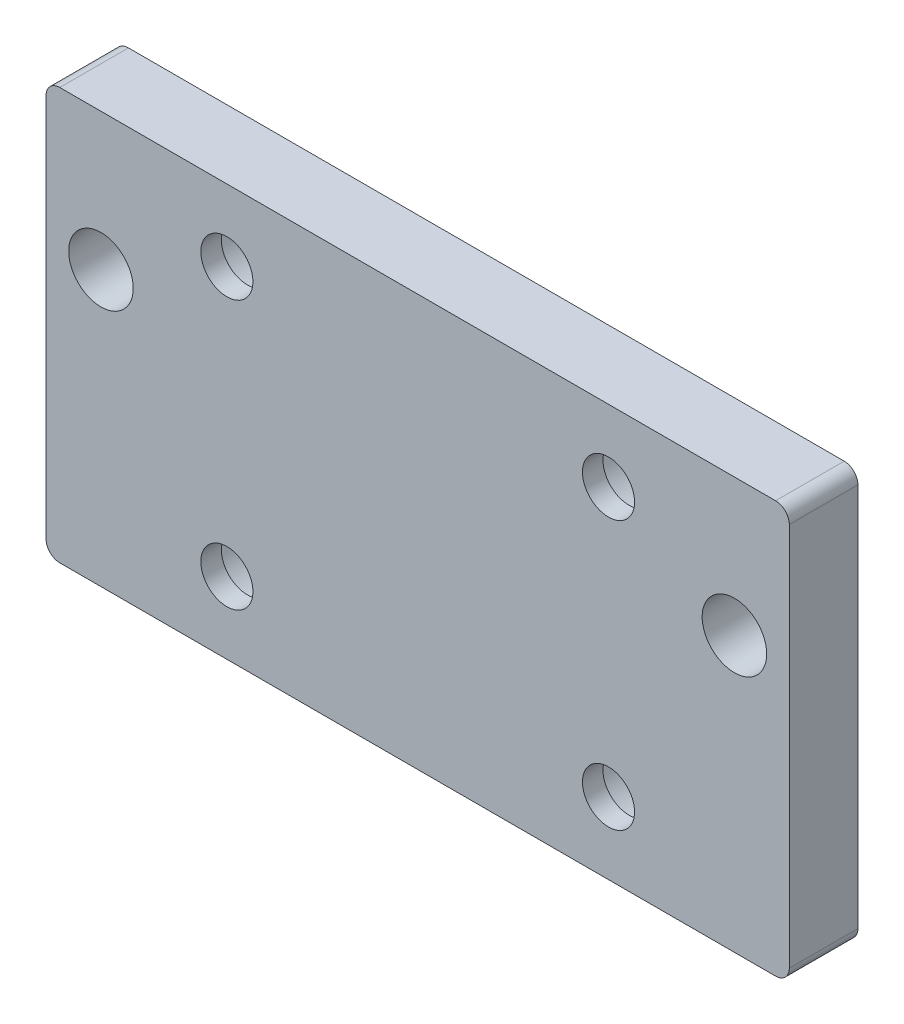
ISO-10303-21;
HEADER;
FILE_DESCRIPTION(('STEP AP214'),'2;1');
FILE_NAME('part.step','',(''),(''),'','','');
FILE_SCHEMA(('AUTOMOTIVE_DESIGN { 1 0 10303 214 1 1 1 1 }'));
ENDSEC;
DATA;
#1=APPLICATION_CONTEXT('core data for automotive mechanical design processes');
#2=APPLICATION_PROTOCOL_DEFINITION('international standard','automotive_design',2000,#1);
#3=PRODUCT_CONTEXT('',#1,'mechanical');
#4=PRODUCT('Part','Part','',(#3));
#5=PRODUCT_RELATED_PRODUCT_CATEGORY('part','',(#4));
#6=PRODUCT_DEFINITION_FORMATION('','',#4);
#7=PRODUCT_DEFINITION_CONTEXT('part definition',#1,'design');
#8=PRODUCT_DEFINITION('design','',#6,#7);
#9=PRODUCT_DEFINITION_SHAPE('','',#8);
#10=(LENGTH_UNIT() NAMED_UNIT(*) SI_UNIT(.MILLI.,.METRE.));
#11=(NAMED_UNIT(*) PLANE_ANGLE_UNIT() SI_UNIT($,.RADIAN.));
#12=(NAMED_UNIT(*) SI_UNIT($,.STERADIAN.) SOLID_ANGLE_UNIT());
#13=UNCERTAINTY_MEASURE_WITH_UNIT(LENGTH_MEASURE(1.E-05),#10,'distance_accuracy_value','');
#14=(GEOMETRIC_REPRESENTATION_CONTEXT(3) GLOBAL_UNCERTAINTY_ASSIGNED_CONTEXT((#13)) GLOBAL_UNIT_ASSIGNED_CONTEXT((#10,
#11,#12)) REPRESENTATION_CONTEXT('',''));
#15=CARTESIAN_POINT('',(0.,0.,0.));
#16=DIRECTION('',(0.,0.,1.));
#17=DIRECTION('',(1.,0.,0.));
#18=AXIS2_PLACEMENT_3D('',#15,#16,#17);
#19=CARTESIAN_POINT('',(0.,0.,5.));
#20=DIRECTION('',(0.,0.,-1.));
#21=DIRECTION('',(-1.,0.,0.));
#22=AXIS2_PLACEMENT_3D('',#19,#20,#21);
#23=PLANE('',#22);
#24=CARTESIAN_POINT('',(40.9859999999998,24.7790000000012,5.));
#25=DIRECTION('',(0.,0.,-1.));
#26=DIRECTION('',(-1.,0.,0.));
#27=AXIS2_PLACEMENT_3D('',#24,#25,#26);
#28=CIRCLE('',#27,1.89865);
#29=CARTESIAN_POINT('',(39.0873499999998,24.7790000000012,5.));
#30=VERTEX_POINT('',#29);
#31=EDGE_CURVE('E218',#30,#30,#28,.T.);
#32=ORIENTED_EDGE('',*,*,#31,.T.);
#33=EDGE_LOOP('',(#32));
#34=FACE_BOUND('',#33,.T.);
#35=CARTESIAN_POINT('',(13.1750000000009,24.779,5.));
#36=DIRECTION('',(0.,0.,-1.));
#37=DIRECTION('',(-1.,0.,0.));
#38=AXIS2_PLACEMENT_3D('',#35,#36,#37);
#39=CIRCLE('',#38,1.89865);
#40=CARTESIAN_POINT('',(11.2763500000009,24.779,5.));
#41=VERTEX_POINT('',#40);
#42=EDGE_CURVE('E206',#41,#41,#39,.T.);
#43=ORIENTED_EDGE('',*,*,#42,.T.);
#44=EDGE_LOOP('',(#43));
#45=FACE_BOUND('',#44,.T.);
#46=CARTESIAN_POINT('',(40.9859999999998,5.22100000000118,5.));
#47=DIRECTION('',(0.,0.,-1.));
#48=DIRECTION('',(-1.,0.,0.));
#49=AXIS2_PLACEMENT_3D('',#46,#47,#48);
#50=CIRCLE('',#49,1.89865);
#51=CARTESIAN_POINT('',(39.0873499999998,5.22100000000118,5.));
#52=VERTEX_POINT('',#51);
#53=EDGE_CURVE('E194',#52,#52,#50,.T.);
#54=ORIENTED_EDGE('',*,*,#53,.T.);
#55=EDGE_LOOP('',(#54));
#56=FACE_BOUND('',#55,.T.);
#57=CARTESIAN_POINT('',(13.1750000000009,5.221,5.));
#58=DIRECTION('',(0.,0.,-1.));
#59=DIRECTION('',(-1.,0.,0.));
#60=AXIS2_PLACEMENT_3D('',#57,#58,#59);
#61=CIRCLE('',#60,1.89865);
#62=CARTESIAN_POINT('',(11.2763500000009,5.221,5.));
#63=VERTEX_POINT('',#62);
#64=EDGE_CURVE('E182',#63,#63,#61,.T.);
#65=ORIENTED_EDGE('',*,*,#64,.T.);
#66=EDGE_LOOP('',(#65));
#67=FACE_BOUND('',#66,.T.);
#68=CARTESIAN_POINT('',(4.,20.,5.));
#69=DIRECTION('',(0.,0.,1.));
#70=DIRECTION('',(1.,0.,0.));
#71=AXIS2_PLACEMENT_3D('',#68,#69,#70);
#72=CIRCLE('',#71,2.35);
#73=CARTESIAN_POINT('',(6.35,20.,5.));
#74=VERTEX_POINT('',#73);
#75=EDGE_CURVE('E179',#74,#74,#72,.T.);
#76=ORIENTED_EDGE('',*,*,#75,.F.);
#77=EDGE_LOOP('',(#76));
#78=FACE_BOUND('',#77,.T.);
#79=DIRECTION('',(0.,1.,0.));
#80=VECTOR('',#79,1.);
#81=CARTESIAN_POINT('',(54.161,0.,5.));
#82=LINE('',#81,#80);
#83=CARTESIAN_POINT('',(54.161,1.,5.));
#84=VERTEX_POINT('',#83);
#85=CARTESIAN_POINT('',(54.161,29.,5.));
#86=VERTEX_POINT('',#85);
#87=EDGE_CURVE('E170',#84,#86,#82,.T.);
#88=ORIENTED_EDGE('',*,*,#87,.T.);
#89=CARTESIAN_POINT('',(53.161,29.,5.));
#90=DIRECTION('',(0.,0.,-1.));
#91=DIRECTION('',(-1.,0.,0.));
#92=AXIS2_PLACEMENT_3D('',#89,#90,#91);
#93=CIRCLE('',#92,1.);
#94=CARTESIAN_POINT('',(53.161,30.,5.));
#95=VERTEX_POINT('',#94);
#96=EDGE_CURVE('E147',#86,#95,#93,.F.);
#97=ORIENTED_EDGE('',*,*,#96,.T.);
#98=DIRECTION('',(-1.,0.,0.));
#99=VECTOR('',#98,1.);
#100=CARTESIAN_POINT('',(0.,30.,5.));
#101=LINE('',#100,#99);
#102=CARTESIAN_POINT('',(1.,30.,5.));
#103=VERTEX_POINT('',#102);
#104=EDGE_CURVE('E119',#95,#103,#101,.T.);
#105=ORIENTED_EDGE('',*,*,#104,.T.);
#106=CARTESIAN_POINT('',(1.,29.,5.));
#107=DIRECTION('',(0.,0.,-1.));
#108=DIRECTION('',(-1.,0.,0.));
#109=AXIS2_PLACEMENT_3D('',#106,#107,#108);
#110=CIRCLE('',#109,1.);
#111=CARTESIAN_POINT('',(0.,29.,5.));
#112=VERTEX_POINT('',#111);
#113=EDGE_CURVE('E142',#103,#112,#110,.F.);
#114=ORIENTED_EDGE('',*,*,#113,.T.);
#115=DIRECTION('',(0.,-1.,0.));
#116=VECTOR('',#115,1.);
#117=CARTESIAN_POINT('',(0.,0.,5.));
#118=LINE('',#117,#116);
#119=CARTESIAN_POINT('',(0.,1.,5.));
#120=VERTEX_POINT('',#119);
#121=EDGE_CURVE('E125',#112,#120,#118,.T.);
#122=ORIENTED_EDGE('',*,*,#121,.T.);
#123=CARTESIAN_POINT('',(1.,1.,5.));
#124=DIRECTION('',(0.,0.,-1.));
#125=DIRECTION('',(-1.,0.,0.));
#126=AXIS2_PLACEMENT_3D('',#123,#124,#125);
#127=CIRCLE('',#126,1.);
#128=CARTESIAN_POINT('',(1.,0.,5.));
#129=VERTEX_POINT('',#128);
#130=EDGE_CURVE('E55',#120,#129,#127,.F.);
#131=ORIENTED_EDGE('',*,*,#130,.T.);
#132=DIRECTION('',(1.,0.,0.));
#133=VECTOR('',#132,1.);
#134=CARTESIAN_POINT('',(0.,0.,5.));
#135=LINE('',#134,#133);
#136=CARTESIAN_POINT('',(53.161,0.,5.));
#137=VERTEX_POINT('',#136);
#138=EDGE_CURVE('E128',#129,#137,#135,.T.);
#139=ORIENTED_EDGE('',*,*,#138,.T.);
#140=CARTESIAN_POINT('',(53.161,1.,5.));
#141=DIRECTION('',(0.,0.,-1.));
#142=DIRECTION('',(-1.,0.,0.));
#143=AXIS2_PLACEMENT_3D('',#140,#141,#142);
#144=CIRCLE('',#143,1.);
#145=EDGE_CURVE('E145',#137,#84,#144,.F.);
#146=ORIENTED_EDGE('',*,*,#145,.T.);
#147=EDGE_LOOP('',(#88,#97,#105,#114,#122,#131,#139,#146));
#148=FACE_BOUND('',#147,.T.);
#149=CARTESIAN_POINT('',(50.161,20.,5.));
#150=DIRECTION('',(0.,0.,1.));
#151=DIRECTION('',(1.,0.,0.));
#152=AXIS2_PLACEMENT_3D('',#149,#150,#151);
#153=CIRCLE('',#152,2.35);
#154=CARTESIAN_POINT('',(52.511,20.,5.));
#155=VERTEX_POINT('',#154);
#156=EDGE_CURVE('E166',#155,#155,#153,.T.);
#157=ORIENTED_EDGE('',*,*,#156,.F.);
#158=EDGE_LOOP('',(#157));
#159=FACE_BOUND('',#158,.T.);
#160=ADVANCED_FACE('F33',(#34,#45,#56,#67,#78,#148,#159),#23,.F.);
#161=CARTESIAN_POINT('',(0.,0.,5.));
#162=DIRECTION('',(1.,0.,0.));
#163=DIRECTION('',(0.,0.,-1.));
#164=AXIS2_PLACEMENT_3D('',#161,#162,#163);
#165=PLANE('',#164);
#166=DIRECTION('',(0.,-1.,0.));
#167=VECTOR('',#166,1.);
#168=CARTESIAN_POINT('',(0.,0.,0.));
#169=LINE('',#168,#167);
#170=CARTESIAN_POINT('',(0.,29.,0.));
#171=VERTEX_POINT('',#170);
#172=CARTESIAN_POINT('',(0.,1.,0.));
#173=VERTEX_POINT('',#172);
#174=EDGE_CURVE('E158',#171,#173,#169,.T.);
#175=ORIENTED_EDGE('',*,*,#174,.T.);
#176=DIRECTION('',(0.,0.,-1.));
#177=VECTOR('',#176,1.);
#178=CARTESIAN_POINT('',(0.,1.,5.));
#179=LINE('',#178,#177);
#180=EDGE_CURVE('E11',#173,#120,#179,.F.);
#181=ORIENTED_EDGE('',*,*,#180,.T.);
#182=ORIENTED_EDGE('',*,*,#121,.F.);
#183=DIRECTION('',(0.,0.,-1.));
#184=VECTOR('',#183,1.);
#185=CARTESIAN_POINT('',(0.,29.,5.));
#186=LINE('',#185,#184);
#187=EDGE_CURVE('E41',#112,#171,#186,.T.);
#188=ORIENTED_EDGE('',*,*,#187,.T.);
#189=EDGE_LOOP('',(#175,#181,#182,#188));
#190=FACE_BOUND('',#189,.T.);
#191=ADVANCED_FACE('F157',(#190),#165,.F.);
#192=CARTESIAN_POINT('',(0.,0.,5.));
#193=DIRECTION('',(0.,1.,0.));
#194=DIRECTION('',(0.,0.,1.));
#195=AXIS2_PLACEMENT_3D('',#192,#193,#194);
#196=PLANE('',#195);
#197=DIRECTION('',(1.,0.,0.));
#198=VECTOR('',#197,1.);
#199=CARTESIAN_POINT('',(0.,0.,0.));
#200=LINE('',#199,#198);
#201=CARTESIAN_POINT('',(1.,0.,0.));
#202=VERTEX_POINT('',#201);
#203=CARTESIAN_POINT('',(53.161,0.,0.));
#204=VERTEX_POINT('',#203);
#205=EDGE_CURVE('E130',#202,#204,#200,.T.);
#206=ORIENTED_EDGE('',*,*,#205,.T.);
#207=DIRECTION('',(0.,0.,-1.));
#208=VECTOR('',#207,1.);
#209=CARTESIAN_POINT('',(53.161,0.,5.));
#210=LINE('',#209,#208);
#211=EDGE_CURVE('E48',#204,#137,#210,.F.);
#212=ORIENTED_EDGE('',*,*,#211,.T.);
#213=ORIENTED_EDGE('',*,*,#138,.F.);
#214=DIRECTION('',(0.,0.,-1.));
#215=VECTOR('',#214,1.);
#216=CARTESIAN_POINT('',(1.,0.,5.));
#217=LINE('',#216,#215);
#218=EDGE_CURVE('E149',#129,#202,#217,.T.);
#219=ORIENTED_EDGE('',*,*,#218,.T.);
#220=EDGE_LOOP('',(#206,#212,#213,#219));
#221=FACE_BOUND('',#220,.T.);
#222=ADVANCED_FACE('F262',(#221),#196,.F.);
#223=CARTESIAN_POINT('',(54.161,0.,5.));
#224=DIRECTION('',(-1.,0.,0.));
#225=DIRECTION('',(0.,0.,1.));
#226=AXIS2_PLACEMENT_3D('',#223,#224,#225);
#227=PLANE('',#226);
#228=DIRECTION('',(0.,1.,0.));
#229=VECTOR('',#228,1.);
#230=CARTESIAN_POINT('',(54.161,0.,0.));
#231=LINE('',#230,#229);
#232=CARTESIAN_POINT('',(54.161,1.,0.));
#233=VERTEX_POINT('',#232);
#234=CARTESIAN_POINT('',(54.161,29.,0.));
#235=VERTEX_POINT('',#234);
#236=EDGE_CURVE('E126',#233,#235,#231,.T.);
#237=ORIENTED_EDGE('',*,*,#236,.T.);
#238=DIRECTION('',(0.,0.,-1.));
#239=VECTOR('',#238,1.);
#240=CARTESIAN_POINT('',(54.161,29.,5.));
#241=LINE('',#240,#239);
#242=EDGE_CURVE('E104',#235,#86,#241,.F.);
#243=ORIENTED_EDGE('',*,*,#242,.T.);
#244=ORIENTED_EDGE('',*,*,#87,.F.);
#245=DIRECTION('',(0.,0.,-1.));
#246=VECTOR('',#245,1.);
#247=CARTESIAN_POINT('',(54.161,1.,5.));
#248=LINE('',#247,#246);
#249=EDGE_CURVE('E109',#84,#233,#248,.T.);
#250=ORIENTED_EDGE('',*,*,#249,.T.);
#251=EDGE_LOOP('',(#237,#243,#244,#250));
#252=FACE_BOUND('',#251,.T.);
#253=ADVANCED_FACE('F268',(#252),#227,.F.);
#254=CARTESIAN_POINT('',(0.,30.,5.));
#255=DIRECTION('',(0.,-1.,0.));
#256=DIRECTION('',(0.,0.,-1.));
#257=AXIS2_PLACEMENT_3D('',#254,#255,#256);
#258=PLANE('',#257);
#259=ORIENTED_EDGE('',*,*,#104,.F.);
#260=DIRECTION('',(0.,0.,-1.));
#261=VECTOR('',#260,1.);
#262=CARTESIAN_POINT('',(53.161,30.,5.));
#263=LINE('',#262,#261);
#264=CARTESIAN_POINT('',(53.161,30.,0.));
#265=VERTEX_POINT('',#264);
#266=EDGE_CURVE('E103',#95,#265,#263,.T.);
#267=ORIENTED_EDGE('',*,*,#266,.T.);
#268=DIRECTION('',(-1.,0.,0.));
#269=VECTOR('',#268,1.);
#270=CARTESIAN_POINT('',(0.,30.,0.));
#271=LINE('',#270,#269);
#272=CARTESIAN_POINT('',(1.,30.,0.));
#273=VERTEX_POINT('',#272);
#274=EDGE_CURVE('E116',#265,#273,#271,.T.);
#275=ORIENTED_EDGE('',*,*,#274,.T.);
#276=DIRECTION('',(0.,0.,-1.));
#277=VECTOR('',#276,1.);
#278=CARTESIAN_POINT('',(1.,30.,5.));
#279=LINE('',#278,#277);
#280=EDGE_CURVE('E121',#273,#103,#279,.F.);
#281=ORIENTED_EDGE('',*,*,#280,.T.);
#282=EDGE_LOOP('',(#259,#267,#275,#281));
#283=FACE_BOUND('',#282,.T.);
#284=ADVANCED_FACE('F115',(#283),#258,.F.);
#285=CARTESIAN_POINT('',(0.,0.,0.));
#286=DIRECTION('',(0.,0.,-1.));
#287=DIRECTION('',(-1.,0.,0.));
#288=AXIS2_PLACEMENT_3D('',#285,#286,#287);
#289=PLANE('',#288);
#290=CARTESIAN_POINT('',(40.9859999999998,24.7790000000012,0.));
#291=DIRECTION('',(0.,0.,-1.));
#292=DIRECTION('',(-1.,0.,0.));
#293=AXIS2_PLACEMENT_3D('',#290,#291,#292);
#294=CIRCLE('',#293,3.57251);
#295=CARTESIAN_POINT('',(37.4134899999998,24.7790000000012,0.));
#296=VERTEX_POINT('',#295);
#297=EDGE_CURVE('E227',#296,#296,#294,.T.);
#298=ORIENTED_EDGE('',*,*,#297,.F.);
#299=EDGE_LOOP('',(#298));
#300=FACE_BOUND('',#299,.T.);
#301=CARTESIAN_POINT('',(13.1750000000009,24.779,0.));
#302=DIRECTION('',(0.,0.,-1.));
#303=DIRECTION('',(-1.,0.,0.));
#304=AXIS2_PLACEMENT_3D('',#301,#302,#303);
#305=CIRCLE('',#304,3.57251);
#306=CARTESIAN_POINT('',(9.60249000000089,24.779,0.));
#307=VERTEX_POINT('',#306);
#308=EDGE_CURVE('E215',#307,#307,#305,.T.);
#309=ORIENTED_EDGE('',*,*,#308,.F.);
#310=EDGE_LOOP('',(#309));
#311=FACE_BOUND('',#310,.T.);
#312=CARTESIAN_POINT('',(40.9859999999998,5.22100000000118,0.));
#313=DIRECTION('',(0.,0.,-1.));
#314=DIRECTION('',(-1.,0.,0.));
#315=AXIS2_PLACEMENT_3D('',#312,#313,#314);
#316=CIRCLE('',#315,3.57251);
#317=CARTESIAN_POINT('',(37.4134899999998,5.22100000000118,0.));
#318=VERTEX_POINT('',#317);
#319=EDGE_CURVE('E203',#318,#318,#316,.T.);
#320=ORIENTED_EDGE('',*,*,#319,.F.);
#321=EDGE_LOOP('',(#320));
#322=FACE_BOUND('',#321,.T.);
#323=CARTESIAN_POINT('',(13.1750000000009,5.221,0.));
#324=DIRECTION('',(0.,0.,-1.));
#325=DIRECTION('',(-1.,0.,0.));
#326=AXIS2_PLACEMENT_3D('',#323,#324,#325);
#327=CIRCLE('',#326,3.57251);
#328=CARTESIAN_POINT('',(9.6024900000009,5.221,0.));
#329=VERTEX_POINT('',#328);
#330=EDGE_CURVE('E191',#329,#329,#327,.T.);
#331=ORIENTED_EDGE('',*,*,#330,.F.);
#332=EDGE_LOOP('',(#331));
#333=FACE_BOUND('',#332,.T.);
#334=CARTESIAN_POINT('',(4.,20.,0.));
#335=DIRECTION('',(0.,0.,-1.));
#336=DIRECTION('',(-1.,0.,0.));
#337=AXIS2_PLACEMENT_3D('',#334,#335,#336);
#338=CIRCLE('',#337,2.35);
#339=CARTESIAN_POINT('',(1.65,20.,0.));
#340=VERTEX_POINT('',#339);
#341=EDGE_CURVE('E176',#340,#340,#338,.T.);
#342=ORIENTED_EDGE('',*,*,#341,.F.);
#343=EDGE_LOOP('',(#342));
#344=FACE_BOUND('',#343,.T.);
#345=CARTESIAN_POINT('',(50.161,20.,0.));
#346=DIRECTION('',(0.,0.,-1.));
#347=DIRECTION('',(-1.,0.,0.));
#348=AXIS2_PLACEMENT_3D('',#345,#346,#347);
#349=CIRCLE('',#348,2.35);
#350=CARTESIAN_POINT('',(47.811,20.,0.));
#351=VERTEX_POINT('',#350);
#352=EDGE_CURVE('E163',#351,#351,#349,.T.);
#353=ORIENTED_EDGE('',*,*,#352,.F.);
#354=EDGE_LOOP('',(#353));
#355=FACE_BOUND('',#354,.T.);
#356=ORIENTED_EDGE('',*,*,#274,.F.);
#357=CARTESIAN_POINT('',(53.161,29.,0.));
#358=DIRECTION('',(0.,0.,-1.));
#359=DIRECTION('',(-1.,0.,0.));
#360=AXIS2_PLACEMENT_3D('',#357,#358,#359);
#361=CIRCLE('',#360,1.);
#362=EDGE_CURVE('E99',#265,#235,#361,.T.);
#363=ORIENTED_EDGE('',*,*,#362,.T.);
#364=ORIENTED_EDGE('',*,*,#236,.F.);
#365=CARTESIAN_POINT('',(53.161,1.,0.));
#366=DIRECTION('',(0.,0.,-1.));
#367=DIRECTION('',(-1.,0.,0.));
#368=AXIS2_PLACEMENT_3D('',#365,#366,#367);
#369=CIRCLE('',#368,1.);
#370=EDGE_CURVE('E110',#233,#204,#369,.T.);
#371=ORIENTED_EDGE('',*,*,#370,.T.);
#372=ORIENTED_EDGE('',*,*,#205,.F.);
#373=CARTESIAN_POINT('',(1.,1.,0.));
#374=DIRECTION('',(0.,0.,-1.));
#375=DIRECTION('',(-1.,0.,0.));
#376=AXIS2_PLACEMENT_3D('',#373,#374,#375);
#377=CIRCLE('',#376,1.);
#378=EDGE_CURVE('E136',#202,#173,#377,.T.);
#379=ORIENTED_EDGE('',*,*,#378,.T.);
#380=ORIENTED_EDGE('',*,*,#174,.F.);
#381=CARTESIAN_POINT('',(1.,29.,0.));
#382=DIRECTION('',(0.,0.,-1.));
#383=DIRECTION('',(-1.,0.,0.));
#384=AXIS2_PLACEMENT_3D('',#381,#382,#383);
#385=CIRCLE('',#384,1.);
#386=EDGE_CURVE('E120',#171,#273,#385,.T.);
#387=ORIENTED_EDGE('',*,*,#386,.T.);
#388=EDGE_LOOP('',(#356,#363,#364,#371,#372,#379,#380,#387));
#389=FACE_BOUND('',#388,.T.);
#390=ADVANCED_FACE('F123',(#300,#311,#322,#333,#344,#355,#389),#289,.T.);
#391=CARTESIAN_POINT('',(50.161,20.,5.));
#392=DIRECTION('',(0.,0.,1.));
#393=DIRECTION('',(1.,0.,0.));
#394=AXIS2_PLACEMENT_3D('',#391,#392,#393);
#395=CYLINDRICAL_SURFACE('',#394,2.35);
#396=ORIENTED_EDGE('',*,*,#156,.T.);
#397=EDGE_LOOP('',(#396));
#398=FACE_BOUND('',#397,.T.);
#399=ORIENTED_EDGE('',*,*,#352,.T.);
#400=EDGE_LOOP('',(#399));
#401=FACE_BOUND('',#400,.T.);
#402=ADVANCED_FACE('F235',(#398,#401),#395,.F.);
#403=CARTESIAN_POINT('',(4.,20.,5.));
#404=DIRECTION('',(0.,0.,1.));
#405=DIRECTION('',(1.,0.,0.));
#406=AXIS2_PLACEMENT_3D('',#403,#404,#405);
#407=CYLINDRICAL_SURFACE('',#406,2.35);
#408=ORIENTED_EDGE('',*,*,#75,.T.);
#409=EDGE_LOOP('',(#408));
#410=FACE_BOUND('',#409,.T.);
#411=ORIENTED_EDGE('',*,*,#341,.T.);
#412=EDGE_LOOP('',(#411));
#413=FACE_BOUND('',#412,.T.);
#414=ADVANCED_FACE('F248',(#410,#413),#407,.F.);
#415=CARTESIAN_POINT('',(53.161,29.,5.));
#416=DIRECTION('',(0.,0.,-1.));
#417=DIRECTION('',(-1.,0.,0.));
#418=AXIS2_PLACEMENT_3D('',#415,#416,#417);
#419=CYLINDRICAL_SURFACE('',#418,1.);
#420=ORIENTED_EDGE('',*,*,#96,.F.);
#421=ORIENTED_EDGE('',*,*,#242,.F.);
#422=ORIENTED_EDGE('',*,*,#362,.F.);
#423=ORIENTED_EDGE('',*,*,#266,.F.);
#424=EDGE_LOOP('',(#420,#421,#422,#423));
#425=FACE_BOUND('',#424,.T.);
#426=ADVANCED_FACE('F102',(#425),#419,.T.);
#427=CARTESIAN_POINT('',(53.161,1.,5.));
#428=DIRECTION('',(0.,0.,-1.));
#429=DIRECTION('',(-1.,0.,0.));
#430=AXIS2_PLACEMENT_3D('',#427,#428,#429);
#431=CYLINDRICAL_SURFACE('',#430,1.);
#432=ORIENTED_EDGE('',*,*,#145,.F.);
#433=ORIENTED_EDGE('',*,*,#211,.F.);
#434=ORIENTED_EDGE('',*,*,#370,.F.);
#435=ORIENTED_EDGE('',*,*,#249,.F.);
#436=EDGE_LOOP('',(#432,#433,#434,#435));
#437=FACE_BOUND('',#436,.T.);
#438=ADVANCED_FACE('F276',(#437),#431,.T.);
#439=CARTESIAN_POINT('',(1.,1.,5.));
#440=DIRECTION('',(0.,0.,-1.));
#441=DIRECTION('',(-1.,0.,0.));
#442=AXIS2_PLACEMENT_3D('',#439,#440,#441);
#443=CYLINDRICAL_SURFACE('',#442,1.);
#444=ORIENTED_EDGE('',*,*,#130,.F.);
#445=ORIENTED_EDGE('',*,*,#180,.F.);
#446=ORIENTED_EDGE('',*,*,#378,.F.);
#447=ORIENTED_EDGE('',*,*,#218,.F.);
#448=EDGE_LOOP('',(#444,#445,#446,#447));
#449=FACE_BOUND('',#448,.T.);
#450=ADVANCED_FACE('F278',(#449),#443,.T.);
#451=CARTESIAN_POINT('',(1.,29.,5.));
#452=DIRECTION('',(0.,0.,-1.));
#453=DIRECTION('',(-1.,0.,0.));
#454=AXIS2_PLACEMENT_3D('',#451,#452,#453);
#455=CYLINDRICAL_SURFACE('',#454,1.);
#456=ORIENTED_EDGE('',*,*,#113,.F.);
#457=ORIENTED_EDGE('',*,*,#280,.F.);
#458=ORIENTED_EDGE('',*,*,#386,.F.);
#459=ORIENTED_EDGE('',*,*,#187,.F.);
#460=EDGE_LOOP('',(#456,#457,#458,#459));
#461=FACE_BOUND('',#460,.T.);
#462=ADVANCED_FACE('F35',(#461),#455,.T.);
#463=CARTESIAN_POINT('',(13.1750000000009,5.221,0.));
#464=DIRECTION('',(0.,0.,-1.));
#465=DIRECTION('',(-1.,0.,0.));
#466=AXIS2_PLACEMENT_3D('',#463,#464,#465);
#467=CYLINDRICAL_SURFACE('',#466,1.89865);
#468=ORIENTED_EDGE('',*,*,#64,.F.);
#469=EDGE_LOOP('',(#468));
#470=FACE_BOUND('',#469,.T.);
#471=CARTESIAN_POINT('',(13.1750000000009,5.221,3.5052));
#472=DIRECTION('',(0.,0.,-1.));
#473=DIRECTION('',(-1.,0.,0.));
#474=AXIS2_PLACEMENT_3D('',#471,#472,#473);
#475=CIRCLE('',#474,1.89865);
#476=CARTESIAN_POINT('',(11.2763500000009,5.221,3.5052));
#477=VERTEX_POINT('',#476);
#478=EDGE_CURVE('E185',#477,#477,#475,.T.);
#479=ORIENTED_EDGE('',*,*,#478,.T.);
#480=EDGE_LOOP('',(#479));
#481=FACE_BOUND('',#480,.T.);
#482=ADVANCED_FACE('F285',(#470,#481),#467,.F.);
#483=CARTESIAN_POINT('',(15.0736500000009,5.221,3.5052));
#484=DIRECTION('',(0.,0.,1.));
#485=DIRECTION('',(1.,0.,0.));
#486=AXIS2_PLACEMENT_3D('',#483,#484,#485);
#487=PLANE('',#486);
#488=ORIENTED_EDGE('',*,*,#478,.F.);
#489=EDGE_LOOP('',(#488));
#490=FACE_BOUND('',#489,.T.);
#491=CARTESIAN_POINT('',(13.1750000000009,5.221,3.5052));
#492=DIRECTION('',(0.,0.,-1.));
#493=DIRECTION('',(-1.,0.,0.));
#494=AXIS2_PLACEMENT_3D('',#491,#492,#493);
#495=CIRCLE('',#494,3.57251);
#496=CARTESIAN_POINT('',(9.6024900000009,5.221,3.5052));
#497=VERTEX_POINT('',#496);
#498=EDGE_CURVE('E188',#497,#497,#495,.T.);
#499=ORIENTED_EDGE('',*,*,#498,.T.);
#500=EDGE_LOOP('',(#499));
#501=FACE_BOUND('',#500,.T.);
#502=ADVANCED_FACE('F295',(#490,#501),#487,.F.);
#503=CARTESIAN_POINT('',(13.1750000000009,5.221,0.));
#504=DIRECTION('',(0.,0.,-1.));
#505=DIRECTION('',(-1.,0.,0.));
#506=AXIS2_PLACEMENT_3D('',#503,#504,#505);
#507=CYLINDRICAL_SURFACE('',#506,3.57251);
#508=ORIENTED_EDGE('',*,*,#498,.F.);
#509=EDGE_LOOP('',(#508));
#510=FACE_BOUND('',#509,.T.);
#511=ORIENTED_EDGE('',*,*,#330,.T.);
#512=EDGE_LOOP('',(#511));
#513=FACE_BOUND('',#512,.T.);
#514=ADVANCED_FACE('F301',(#510,#513),#507,.F.);
#515=CARTESIAN_POINT('',(40.9859999999998,5.22100000000118,0.));
#516=DIRECTION('',(0.,0.,-1.));
#517=DIRECTION('',(-1.,0.,0.));
#518=AXIS2_PLACEMENT_3D('',#515,#516,#517);
#519=CYLINDRICAL_SURFACE('',#518,1.89865);
#520=ORIENTED_EDGE('',*,*,#53,.F.);
#521=EDGE_LOOP('',(#520));
#522=FACE_BOUND('',#521,.T.);
#523=CARTESIAN_POINT('',(40.9859999999998,5.22100000000118,3.5052));
#524=DIRECTION('',(0.,0.,-1.));
#525=DIRECTION('',(-1.,0.,0.));
#526=AXIS2_PLACEMENT_3D('',#523,#524,#525);
#527=CIRCLE('',#526,1.89865);
#528=CARTESIAN_POINT('',(39.0873499999998,5.22100000000118,3.5052));
#529=VERTEX_POINT('',#528);
#530=EDGE_CURVE('E197',#529,#529,#527,.T.);
#531=ORIENTED_EDGE('',*,*,#530,.T.);
#532=EDGE_LOOP('',(#531));
#533=FACE_BOUND('',#532,.T.);
#534=ADVANCED_FACE('F309',(#522,#533),#519,.F.);
#535=CARTESIAN_POINT('',(42.8846499999998,5.22100000000118,3.5052));
#536=DIRECTION('',(0.,0.,1.));
#537=DIRECTION('',(1.,0.,0.));
#538=AXIS2_PLACEMENT_3D('',#535,#536,#537);
#539=PLANE('',#538);
#540=ORIENTED_EDGE('',*,*,#530,.F.);
#541=EDGE_LOOP('',(#540));
#542=FACE_BOUND('',#541,.T.);
#543=CARTESIAN_POINT('',(40.9859999999998,5.22100000000118,3.5052));
#544=DIRECTION('',(0.,0.,-1.));
#545=DIRECTION('',(-1.,0.,0.));
#546=AXIS2_PLACEMENT_3D('',#543,#544,#545);
#547=CIRCLE('',#546,3.57251);
#548=CARTESIAN_POINT('',(37.4134899999998,5.22100000000118,3.5052));
#549=VERTEX_POINT('',#548);
#550=EDGE_CURVE('E200',#549,#549,#547,.T.);
#551=ORIENTED_EDGE('',*,*,#550,.T.);
#552=EDGE_LOOP('',(#551));
#553=FACE_BOUND('',#552,.T.);
#554=ADVANCED_FACE('F313',(#542,#553),#539,.F.);
#555=CARTESIAN_POINT('',(40.9859999999998,5.22100000000118,0.));
#556=DIRECTION('',(0.,0.,-1.));
#557=DIRECTION('',(-1.,0.,0.));
#558=AXIS2_PLACEMENT_3D('',#555,#556,#557);
#559=CYLINDRICAL_SURFACE('',#558,3.57251);
#560=ORIENTED_EDGE('',*,*,#550,.F.);
#561=EDGE_LOOP('',(#560));
#562=FACE_BOUND('',#561,.T.);
#563=ORIENTED_EDGE('',*,*,#319,.T.);
#564=EDGE_LOOP('',(#563));
#565=FACE_BOUND('',#564,.T.);
#566=ADVANCED_FACE('F317',(#562,#565),#559,.F.);
#567=CARTESIAN_POINT('',(13.1750000000009,24.779,0.));
#568=DIRECTION('',(0.,0.,-1.));
#569=DIRECTION('',(-1.,0.,0.));
#570=AXIS2_PLACEMENT_3D('',#567,#568,#569);
#571=CYLINDRICAL_SURFACE('',#570,1.89865);
#572=ORIENTED_EDGE('',*,*,#42,.F.);
#573=EDGE_LOOP('',(#572));
#574=FACE_BOUND('',#573,.T.);
#575=CARTESIAN_POINT('',(13.1750000000009,24.779,3.5052));
#576=DIRECTION('',(0.,0.,-1.));
#577=DIRECTION('',(-1.,0.,0.));
#578=AXIS2_PLACEMENT_3D('',#575,#576,#577);
#579=CIRCLE('',#578,1.89865);
#580=CARTESIAN_POINT('',(11.2763500000009,24.779,3.5052));
#581=VERTEX_POINT('',#580);
#582=EDGE_CURVE('E209',#581,#581,#579,.T.);
#583=ORIENTED_EDGE('',*,*,#582,.T.);
#584=EDGE_LOOP('',(#583));
#585=FACE_BOUND('',#584,.T.);
#586=ADVANCED_FACE('F321',(#574,#585),#571,.F.);
#587=CARTESIAN_POINT('',(15.0736500000009,24.779,3.5052));
#588=DIRECTION('',(0.,0.,1.));
#589=DIRECTION('',(1.,0.,0.));
#590=AXIS2_PLACEMENT_3D('',#587,#588,#589);
#591=PLANE('',#590);
#592=ORIENTED_EDGE('',*,*,#582,.F.);
#593=EDGE_LOOP('',(#592));
#594=FACE_BOUND('',#593,.T.);
#595=CARTESIAN_POINT('',(13.1750000000009,24.779,3.5052));
#596=DIRECTION('',(0.,0.,-1.));
#597=DIRECTION('',(-1.,0.,0.));
#598=AXIS2_PLACEMENT_3D('',#595,#596,#597);
#599=CIRCLE('',#598,3.57251);
#600=CARTESIAN_POINT('',(9.60249000000089,24.779,3.5052));
#601=VERTEX_POINT('',#600);
#602=EDGE_CURVE('E212',#601,#601,#599,.T.);
#603=ORIENTED_EDGE('',*,*,#602,.T.);
#604=EDGE_LOOP('',(#603));
#605=FACE_BOUND('',#604,.T.);
#606=ADVANCED_FACE('F325',(#594,#605),#591,.F.);
#607=CARTESIAN_POINT('',(13.1750000000009,24.779,0.));
#608=DIRECTION('',(0.,0.,-1.));
#609=DIRECTION('',(-1.,0.,0.));
#610=AXIS2_PLACEMENT_3D('',#607,#608,#609);
#611=CYLINDRICAL_SURFACE('',#610,3.57251);
#612=ORIENTED_EDGE('',*,*,#602,.F.);
#613=EDGE_LOOP('',(#612));
#614=FACE_BOUND('',#613,.T.);
#615=ORIENTED_EDGE('',*,*,#308,.T.);
#616=EDGE_LOOP('',(#615));
#617=FACE_BOUND('',#616,.T.);
#618=ADVANCED_FACE('F329',(#614,#617),#611,.F.);
#619=CARTESIAN_POINT('',(40.9859999999998,24.7790000000012,0.));
#620=DIRECTION('',(0.,0.,-1.));
#621=DIRECTION('',(-1.,0.,0.));
#622=AXIS2_PLACEMENT_3D('',#619,#620,#621);
#623=CYLINDRICAL_SURFACE('',#622,1.89865);
#624=ORIENTED_EDGE('',*,*,#31,.F.);
#625=EDGE_LOOP('',(#624));
#626=FACE_BOUND('',#625,.T.);
#627=CARTESIAN_POINT('',(40.9859999999998,24.7790000000012,3.5052));
#628=DIRECTION('',(0.,0.,-1.));
#629=DIRECTION('',(-1.,0.,0.));
#630=AXIS2_PLACEMENT_3D('',#627,#628,#629);
#631=CIRCLE('',#630,1.89865);
#632=CARTESIAN_POINT('',(39.0873499999998,24.7790000000012,3.5052));
#633=VERTEX_POINT('',#632);
#634=EDGE_CURVE('E221',#633,#633,#631,.T.);
#635=ORIENTED_EDGE('',*,*,#634,.T.);
#636=EDGE_LOOP('',(#635));
#637=FACE_BOUND('',#636,.T.);
#638=ADVANCED_FACE('F333',(#626,#637),#623,.F.);
#639=CARTESIAN_POINT('',(42.8846499999998,24.7790000000012,3.5052));
#640=DIRECTION('',(0.,0.,1.));
#641=DIRECTION('',(1.,0.,0.));
#642=AXIS2_PLACEMENT_3D('',#639,#640,#641);
#643=PLANE('',#642);
#644=ORIENTED_EDGE('',*,*,#634,.F.);
#645=EDGE_LOOP('',(#644));
#646=FACE_BOUND('',#645,.T.);
#647=CARTESIAN_POINT('',(40.9859999999998,24.7790000000012,3.5052));
#648=DIRECTION('',(0.,0.,-1.));
#649=DIRECTION('',(-1.,0.,0.));
#650=AXIS2_PLACEMENT_3D('',#647,#648,#649);
#651=CIRCLE('',#650,3.57251);
#652=CARTESIAN_POINT('',(37.4134899999998,24.7790000000012,3.5052));
#653=VERTEX_POINT('',#652);
#654=EDGE_CURVE('E224',#653,#653,#651,.T.);
#655=ORIENTED_EDGE('',*,*,#654,.T.);
#656=EDGE_LOOP('',(#655));
#657=FACE_BOUND('',#656,.T.);
#658=ADVANCED_FACE('F337',(#646,#657),#643,.F.);
#659=CARTESIAN_POINT('',(40.9859999999998,24.7790000000012,0.));
#660=DIRECTION('',(0.,0.,-1.));
#661=DIRECTION('',(-1.,0.,0.));
#662=AXIS2_PLACEMENT_3D('',#659,#660,#661);
#663=CYLINDRICAL_SURFACE('',#662,3.57251);
#664=ORIENTED_EDGE('',*,*,#654,.F.);
#665=EDGE_LOOP('',(#664));
#666=FACE_BOUND('',#665,.T.);
#667=ORIENTED_EDGE('',*,*,#297,.T.);
#668=EDGE_LOOP('',(#667));
#669=FACE_BOUND('',#668,.T.);
#670=ADVANCED_FACE('F231',(#666,#669),#663,.F.);
#671=CLOSED_SHELL('',(#160,#191,#222,#253,#284,#390,#402,#414,#426,#438,#450,#462,#482,#502,
#514,#534,#554,#566,#586,#606,#618,#638,#658,#670));
#672=MANIFOLD_SOLID_BREP('B2',#671);
#673=ADVANCED_BREP_SHAPE_REPRESENTATION('',(#18,#672),#14);
#674=SHAPE_DEFINITION_REPRESENTATION(#9,#673);
ENDSEC;
END-ISO-10303-21;
